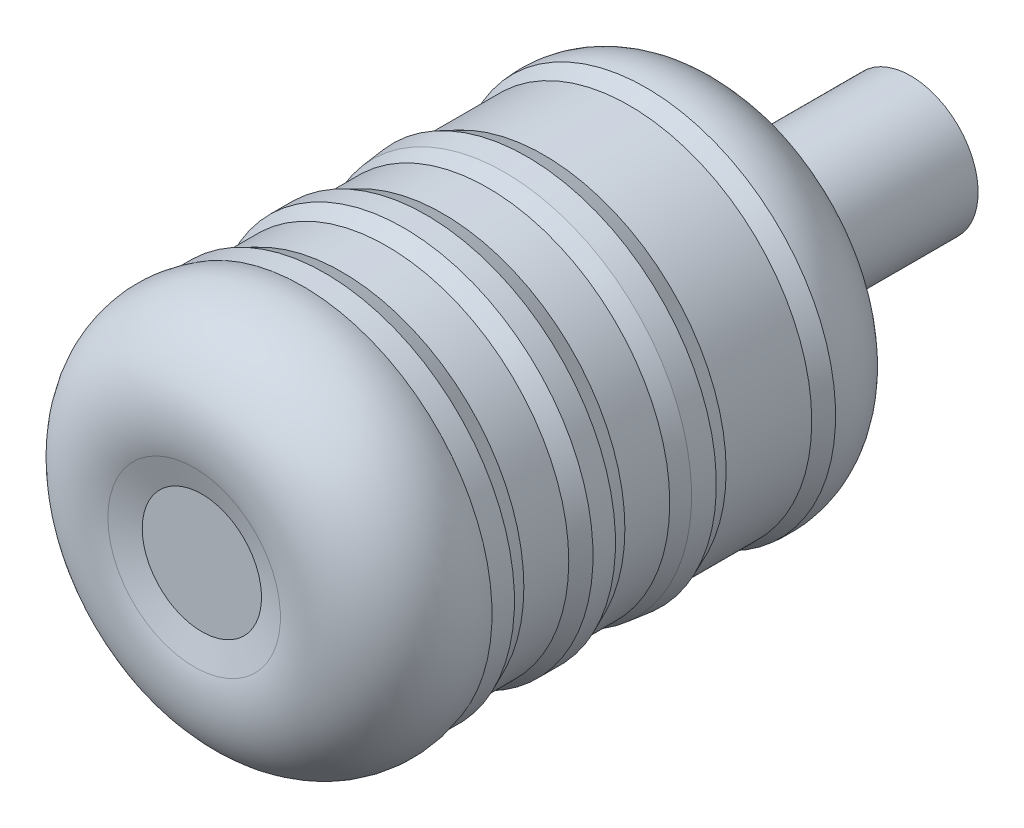
ISO-10303-21;
HEADER;
FILE_DESCRIPTION(('STEP AP214'),'2;1');
FILE_NAME('part.step','',(''),(''),'','','');
FILE_SCHEMA(('AUTOMOTIVE_DESIGN { 1 0 10303 214 1 1 1 1 }'));
ENDSEC;
DATA;
#1=APPLICATION_CONTEXT('core data for automotive mechanical design processes');
#2=APPLICATION_PROTOCOL_DEFINITION('international standard','automotive_design',2000,#1);
#3=PRODUCT_CONTEXT('',#1,'mechanical');
#4=PRODUCT('Part','Part','',(#3));
#5=PRODUCT_RELATED_PRODUCT_CATEGORY('part','',(#4));
#6=PRODUCT_DEFINITION_FORMATION('','',#4);
#7=PRODUCT_DEFINITION_CONTEXT('part definition',#1,'design');
#8=PRODUCT_DEFINITION('design','',#6,#7);
#9=PRODUCT_DEFINITION_SHAPE('','',#8);
#10=(LENGTH_UNIT() NAMED_UNIT(*) SI_UNIT(.MILLI.,.METRE.));
#11=(NAMED_UNIT(*) PLANE_ANGLE_UNIT() SI_UNIT($,.RADIAN.));
#12=(NAMED_UNIT(*) SI_UNIT($,.STERADIAN.) SOLID_ANGLE_UNIT());
#13=UNCERTAINTY_MEASURE_WITH_UNIT(LENGTH_MEASURE(1.E-05),#10,'distance_accuracy_value','');
#14=(GEOMETRIC_REPRESENTATION_CONTEXT(3) GLOBAL_UNCERTAINTY_ASSIGNED_CONTEXT((#13)) GLOBAL_UNIT_ASSIGNED_CONTEXT((#10,
#11,#12)) REPRESENTATION_CONTEXT('',''));
#15=CARTESIAN_POINT('',(0.,0.,0.));
#16=DIRECTION('',(0.,0.,1.));
#17=DIRECTION('',(1.,0.,0.));
#18=AXIS2_PLACEMENT_3D('',#15,#16,#17);
#19=CARTESIAN_POINT('',(501.774797420764,0.,-5.50281641635375));
#20=DIRECTION('',(0.,0.,1.));
#21=DIRECTION('',(1.,0.,0.));
#22=AXIS2_PLACEMENT_3D('',#19,#20,#21);
#23=CONICAL_SURFACE('',#22,42.5,1.28888769328042);
#24=CARTESIAN_POINT('',(501.774797420764,0.,0.));
#25=DIRECTION('',(0.,0.,-1.));
#26=DIRECTION('',(-1.,0.,0.));
#27=AXIS2_PLACEMENT_3D('',#24,#25,#26);
#28=CIRCLE('',#27,61.5000000000001);
#29=CARTESIAN_POINT('',(440.274797420764,0.,0.));
#30=VERTEX_POINT('',#29);
#31=EDGE_CURVE('E10',#30,#30,#28,.T.);
#32=ORIENTED_EDGE('',*,*,#31,.F.);
#33=EDGE_LOOP('',(#32));
#34=FACE_BOUND('',#33,.T.);
#35=CARTESIAN_POINT('',(501.774797420764,0.,-5.50281641635375));
#36=DIRECTION('',(0.,0.,-1.));
#37=DIRECTION('',(-1.,0.,0.));
#38=AXIS2_PLACEMENT_3D('',#35,#36,#37);
#39=CIRCLE('',#38,42.5);
#40=CARTESIAN_POINT('',(459.274797420764,0.,-5.50281641635372));
#41=VERTEX_POINT('',#40);
#42=EDGE_CURVE('E115',#41,#41,#39,.T.);
#43=ORIENTED_EDGE('',*,*,#42,.T.);
#44=EDGE_LOOP('',(#43));
#45=FACE_BOUND('',#44,.T.);
#46=ADVANCED_FACE('F34',(#34,#45),#23,.F.);
#47=CARTESIAN_POINT('',(501.774797420764,0.,-57.5919534258639));
#48=DIRECTION('',(0.,0.,-1.));
#49=DIRECTION('',(-1.,0.,0.));
#50=AXIS2_PLACEMENT_3D('',#47,#48,#49);
#51=TOROIDAL_SURFACE('',#50,78.3275637153188,60.);
#52=CARTESIAN_POINT('',(501.774797420764,0.,-77.2956324112399));
#53=DIRECTION('',(0.,0.,-1.));
#54=DIRECTION('',(-1.,0.,0.));
#55=AXIS2_PLACEMENT_3D('',#52,#53,#54);
#56=CIRCLE('',#55,135.);
#57=CARTESIAN_POINT('',(366.774797420764,0.,-77.2956324112398));
#58=VERTEX_POINT('',#57);
#59=EDGE_CURVE('E41',#58,#58,#56,.T.);
#60=ORIENTED_EDGE('',*,*,#59,.F.);
#61=EDGE_LOOP('',(#60));
#62=FACE_BOUND('',#61,.T.);
#63=ORIENTED_EDGE('',*,*,#31,.T.);
#64=EDGE_LOOP('',(#63));
#65=FACE_BOUND('',#64,.T.);
#66=ADVANCED_FACE('F215',(#62,#65),#51,.T.);
#67=CARTESIAN_POINT('',(501.774797420764,0.,-510.755898754772));
#68=DIRECTION('',(0.,0.,-1.));
#69=DIRECTION('',(-1.,0.,0.));
#70=AXIS2_PLACEMENT_3D('',#67,#68,#69);
#71=CYLINDRICAL_SURFACE('',#70,135.);
#72=ORIENTED_EDGE('',*,*,#59,.T.);
#73=EDGE_LOOP('',(#72));
#74=FACE_BOUND('',#73,.T.);
#75=CARTESIAN_POINT('',(501.774797420764,0.,-93.2956324112398));
#76=DIRECTION('',(0.,0.,-1.));
#77=DIRECTION('',(-1.,0.,0.));
#78=AXIS2_PLACEMENT_3D('',#75,#76,#77);
#79=CIRCLE('',#78,135.);
#80=CARTESIAN_POINT('',(366.774797420764,0.,-93.2956324112398));
#81=VERTEX_POINT('',#80);
#82=EDGE_CURVE('E47',#81,#81,#79,.T.);
#83=ORIENTED_EDGE('',*,*,#82,.F.);
#84=EDGE_LOOP('',(#83));
#85=FACE_BOUND('',#84,.T.);
#86=ADVANCED_FACE('F220',(#74,#85),#71,.T.);
#87=CARTESIAN_POINT('',(501.774797420764,0.,-105.29563241124));
#88=DIRECTION('',(0.,0.,1.));
#89=DIRECTION('',(1.,0.,0.));
#90=AXIS2_PLACEMENT_3D('',#87,#88,#89);
#91=CONICAL_SURFACE('',#90,129.7034295628,0.41566318038225);
#92=ORIENTED_EDGE('',*,*,#82,.T.);
#93=EDGE_LOOP('',(#92));
#94=FACE_BOUND('',#93,.T.);
#95=CARTESIAN_POINT('',(501.774797420764,0.,-105.29563241124));
#96=DIRECTION('',(0.,0.,-1.));
#97=DIRECTION('',(-1.,0.,0.));
#98=AXIS2_PLACEMENT_3D('',#95,#96,#97);
#99=CIRCLE('',#98,129.7034295628);
#100=CARTESIAN_POINT('',(372.071367857964,0.,-105.29563241124));
#101=VERTEX_POINT('',#100);
#102=EDGE_CURVE('E53',#101,#101,#99,.T.);
#103=ORIENTED_EDGE('',*,*,#102,.F.);
#104=EDGE_LOOP('',(#103));
#105=FACE_BOUND('',#104,.T.);
#106=ADVANCED_FACE('F292',(#94,#105),#91,.T.);
#107=CARTESIAN_POINT('',(501.774797420764,0.,-510.755898754772));
#108=DIRECTION('',(0.,0.,-1.));
#109=DIRECTION('',(-1.,0.,0.));
#110=AXIS2_PLACEMENT_3D('',#107,#108,#109);
#111=CYLINDRICAL_SURFACE('',#110,129.7034295628);
#112=ORIENTED_EDGE('',*,*,#102,.T.);
#113=EDGE_LOOP('',(#112));
#114=FACE_BOUND('',#113,.T.);
#115=CARTESIAN_POINT('',(501.774797420764,0.,-137.29563241124));
#116=DIRECTION('',(0.,0.,-1.));
#117=DIRECTION('',(-1.,0.,0.));
#118=AXIS2_PLACEMENT_3D('',#115,#116,#117);
#119=CIRCLE('',#118,129.7034295628);
#120=CARTESIAN_POINT('',(372.071367857964,0.,-137.29563241124));
#121=VERTEX_POINT('',#120);
#122=EDGE_CURVE('E59',#121,#121,#119,.T.);
#123=ORIENTED_EDGE('',*,*,#122,.F.);
#124=EDGE_LOOP('',(#123));
#125=FACE_BOUND('',#124,.T.);
#126=ADVANCED_FACE('F288',(#114,#125),#111,.T.);
#127=CARTESIAN_POINT('',(501.774797420764,0.,-149.29563241124));
#128=DIRECTION('',(0.,0.,-1.));
#129=DIRECTION('',(-1.,0.,0.));
#130=AXIS2_PLACEMENT_3D('',#127,#128,#129);
#131=CONICAL_SURFACE('',#130,135.,0.415663180382242);
#132=ORIENTED_EDGE('',*,*,#122,.T.);
#133=EDGE_LOOP('',(#132));
#134=FACE_BOUND('',#133,.T.);
#135=CARTESIAN_POINT('',(501.774797420764,0.,-149.29563241124));
#136=DIRECTION('',(0.,0.,-1.));
#137=DIRECTION('',(-1.,0.,0.));
#138=AXIS2_PLACEMENT_3D('',#135,#136,#137);
#139=CIRCLE('',#138,135.);
#140=CARTESIAN_POINT('',(366.774797420764,0.,-149.29563241124));
#141=VERTEX_POINT('',#140);
#142=EDGE_CURVE('E63',#141,#141,#139,.T.);
#143=ORIENTED_EDGE('',*,*,#142,.F.);
#144=EDGE_LOOP('',(#143));
#145=FACE_BOUND('',#144,.T.);
#146=ADVANCED_FACE('F284',(#134,#145),#131,.T.);
#147=CARTESIAN_POINT('',(501.774797420764,0.,-510.755898754772));
#148=DIRECTION('',(0.,0.,-1.));
#149=DIRECTION('',(-1.,0.,0.));
#150=AXIS2_PLACEMENT_3D('',#147,#148,#149);
#151=CYLINDRICAL_SURFACE('',#150,135.);
#152=ORIENTED_EDGE('',*,*,#142,.T.);
#153=EDGE_LOOP('',(#152));
#154=FACE_BOUND('',#153,.T.);
#155=CARTESIAN_POINT('',(501.774797420764,0.,-165.29563241124));
#156=DIRECTION('',(0.,0.,-1.));
#157=DIRECTION('',(-1.,0.,0.));
#158=AXIS2_PLACEMENT_3D('',#155,#156,#157);
#159=CIRCLE('',#158,135.);
#160=CARTESIAN_POINT('',(366.774797420764,0.,-165.29563241124));
#161=VERTEX_POINT('',#160);
#162=EDGE_CURVE('E67',#161,#161,#159,.T.);
#163=ORIENTED_EDGE('',*,*,#162,.F.);
#164=EDGE_LOOP('',(#163));
#165=FACE_BOUND('',#164,.T.);
#166=ADVANCED_FACE('F280',(#154,#165),#151,.T.);
#167=CARTESIAN_POINT('',(501.774797420764,0.,-177.29563241124));
#168=DIRECTION('',(0.,0.,1.));
#169=DIRECTION('',(1.,0.,0.));
#170=AXIS2_PLACEMENT_3D('',#167,#168,#169);
#171=CONICAL_SURFACE('',#170,129.7034295628,0.415663180382242);
#172=ORIENTED_EDGE('',*,*,#162,.T.);
#173=EDGE_LOOP('',(#172));
#174=FACE_BOUND('',#173,.T.);
#175=CARTESIAN_POINT('',(501.774797420764,0.,-177.29563241124));
#176=DIRECTION('',(0.,0.,-1.));
#177=DIRECTION('',(-1.,0.,0.));
#178=AXIS2_PLACEMENT_3D('',#175,#176,#177);
#179=CIRCLE('',#178,129.7034295628);
#180=CARTESIAN_POINT('',(372.071367857964,0.,-177.29563241124));
#181=VERTEX_POINT('',#180);
#182=EDGE_CURVE('E71',#181,#181,#179,.T.);
#183=ORIENTED_EDGE('',*,*,#182,.F.);
#184=EDGE_LOOP('',(#183));
#185=FACE_BOUND('',#184,.T.);
#186=ADVANCED_FACE('F276',(#174,#185),#171,.T.);
#187=CARTESIAN_POINT('',(501.774797420764,0.,-510.755898754772));
#188=DIRECTION('',(0.,0.,-1.));
#189=DIRECTION('',(-1.,0.,0.));
#190=AXIS2_PLACEMENT_3D('',#187,#188,#189);
#191=CYLINDRICAL_SURFACE('',#190,129.7034295628);
#192=ORIENTED_EDGE('',*,*,#182,.T.);
#193=EDGE_LOOP('',(#192));
#194=FACE_BOUND('',#193,.T.);
#195=CARTESIAN_POINT('',(501.774797420764,0.,-209.268332015546));
#196=DIRECTION('',(0.,0.,-1.));
#197=DIRECTION('',(-1.,0.,0.));
#198=AXIS2_PLACEMENT_3D('',#195,#196,#197);
#199=CIRCLE('',#198,129.7034295628);
#200=CARTESIAN_POINT('',(372.071367857964,0.,-209.268332015545));
#201=VERTEX_POINT('',#200);
#202=EDGE_CURVE('E75',#201,#201,#199,.T.);
#203=ORIENTED_EDGE('',*,*,#202,.F.);
#204=EDGE_LOOP('',(#203));
#205=FACE_BOUND('',#204,.T.);
#206=ADVANCED_FACE('F272',(#194,#205),#191,.T.);
#207=CARTESIAN_POINT('',(501.774797420764,0.,-221.268332015546));
#208=DIRECTION('',(0.,0.,-1.));
#209=DIRECTION('',(-1.,0.,0.));
#210=AXIS2_PLACEMENT_3D('',#207,#208,#209);
#211=CONICAL_SURFACE('',#210,133.251601016314,0.287489672333788);
#212=ORIENTED_EDGE('',*,*,#202,.T.);
#213=EDGE_LOOP('',(#212));
#214=FACE_BOUND('',#213,.T.);
#215=CARTESIAN_POINT('',(501.774797420764,0.,-221.268332015546));
#216=DIRECTION('',(0.,0.,-1.));
#217=DIRECTION('',(-1.,0.,0.));
#218=AXIS2_PLACEMENT_3D('',#215,#216,#217);
#219=CIRCLE('',#218,133.251601016314);
#220=CARTESIAN_POINT('',(368.52319640445,0.,-221.268332015545));
#221=VERTEX_POINT('',#220);
#222=EDGE_CURVE('E79',#221,#221,#219,.T.);
#223=ORIENTED_EDGE('',*,*,#222,.F.);
#224=EDGE_LOOP('',(#223));
#225=FACE_BOUND('',#224,.T.);
#226=ADVANCED_FACE('F268',(#214,#225),#211,.T.);
#227=CARTESIAN_POINT('',(501.774797420764,0.,-237.172517030624));
#228=DIRECTION('',(0.,0.,-1.));
#229=DIRECTION('',(-1.,0.,0.));
#230=AXIS2_PLACEMENT_3D('',#227,#228,#229);
#231=CONICAL_SURFACE('',#230,135.,0.109493588999654);
#232=ORIENTED_EDGE('',*,*,#222,.T.);
#233=EDGE_LOOP('',(#232));
#234=FACE_BOUND('',#233,.T.);
#235=CARTESIAN_POINT('',(501.774797420764,0.,-237.172517030624));
#236=DIRECTION('',(0.,0.,-1.));
#237=DIRECTION('',(-1.,0.,0.));
#238=AXIS2_PLACEMENT_3D('',#235,#236,#237);
#239=CIRCLE('',#238,135.);
#240=CARTESIAN_POINT('',(366.774797420764,0.,-237.172517030624));
#241=VERTEX_POINT('',#240);
#242=EDGE_CURVE('E83',#241,#241,#239,.T.);
#243=ORIENTED_EDGE('',*,*,#242,.F.);
#244=EDGE_LOOP('',(#243));
#245=FACE_BOUND('',#244,.T.);
#246=ADVANCED_FACE('F264',(#234,#245),#231,.T.);
#247=CARTESIAN_POINT('',(501.774797420764,0.,-237.172517030624));
#248=DIRECTION('',(0.,0.,1.));
#249=DIRECTION('',(1.,0.,0.));
#250=AXIS2_PLACEMENT_3D('',#247,#248,#249);
#251=CONICAL_SURFACE('',#250,135.,0.394791119699769);
#252=CARTESIAN_POINT('',(501.774797420764,0.,-249.172517030624));
#253=DIRECTION('',(0.,0.,-1.));
#254=DIRECTION('',(-1.,0.,0.));
#255=AXIS2_PLACEMENT_3D('',#252,#253,#254);
#256=CIRCLE('',#255,130.);
#257=CARTESIAN_POINT('',(371.774797420764,0.,-249.172517030624));
#258=VERTEX_POINT('',#257);
#259=EDGE_CURVE('E87',#258,#258,#256,.T.);
#260=ORIENTED_EDGE('',*,*,#259,.F.);
#261=EDGE_LOOP('',(#260));
#262=FACE_BOUND('',#261,.T.);
#263=ORIENTED_EDGE('',*,*,#242,.T.);
#264=EDGE_LOOP('',(#263));
#265=FACE_BOUND('',#264,.T.);
#266=ADVANCED_FACE('F260',(#262,#265),#251,.T.);
#267=CARTESIAN_POINT('',(501.774797420764,0.,-510.755898754772));
#268=DIRECTION('',(0.,0.,-1.));
#269=DIRECTION('',(-1.,0.,0.));
#270=AXIS2_PLACEMENT_3D('',#267,#268,#269);
#271=CYLINDRICAL_SURFACE('',#270,130.);
#272=ORIENTED_EDGE('',*,*,#259,.T.);
#273=EDGE_LOOP('',(#272));
#274=FACE_BOUND('',#273,.T.);
#275=CARTESIAN_POINT('',(501.774797420764,0.,-310.172517030624));
#276=DIRECTION('',(0.,0.,-1.));
#277=DIRECTION('',(-1.,0.,0.));
#278=AXIS2_PLACEMENT_3D('',#275,#276,#277);
#279=CIRCLE('',#278,130.);
#280=CARTESIAN_POINT('',(371.774797420764,0.,-310.172517030624));
#281=VERTEX_POINT('',#280);
#282=EDGE_CURVE('E91',#281,#281,#279,.T.);
#283=ORIENTED_EDGE('',*,*,#282,.F.);
#284=EDGE_LOOP('',(#283));
#285=FACE_BOUND('',#284,.T.);
#286=ADVANCED_FACE('F256',(#274,#285),#271,.T.);
#287=CARTESIAN_POINT('',(501.774797420764,0.,-322.172517030624));
#288=DIRECTION('',(0.,0.,-1.));
#289=DIRECTION('',(-1.,0.,0.));
#290=AXIS2_PLACEMENT_3D('',#287,#288,#289);
#291=CONICAL_SURFACE('',#290,135.,0.394791119699754);
#292=ORIENTED_EDGE('',*,*,#282,.T.);
#293=EDGE_LOOP('',(#292));
#294=FACE_BOUND('',#293,.T.);
#295=CARTESIAN_POINT('',(501.774797420764,0.,-322.172517030624));
#296=DIRECTION('',(0.,0.,-1.));
#297=DIRECTION('',(-1.,0.,0.));
#298=AXIS2_PLACEMENT_3D('',#295,#296,#297);
#299=CIRCLE('',#298,135.);
#300=CARTESIAN_POINT('',(366.774797420764,0.,-322.172517030624));
#301=VERTEX_POINT('',#300);
#302=EDGE_CURVE('E95',#301,#301,#299,.T.);
#303=ORIENTED_EDGE('',*,*,#302,.F.);
#304=EDGE_LOOP('',(#303));
#305=FACE_BOUND('',#304,.T.);
#306=ADVANCED_FACE('F252',(#294,#305),#291,.T.);
#307=CARTESIAN_POINT('',(501.774797420764,0.,-328.860913406549));
#308=DIRECTION('',(0.,0.,-1.));
#309=DIRECTION('',(-1.,0.,0.));
#310=AXIS2_PLACEMENT_3D('',#307,#308,#309);
#311=TOROIDAL_SURFACE('',#310,80.4081933444357,55.);
#312=ORIENTED_EDGE('',*,*,#302,.T.);
#313=EDGE_LOOP('',(#312));
#314=FACE_BOUND('',#313,.T.);
#315=CARTESIAN_POINT('',(501.774797420764,0.,-381.516955266005));
#316=DIRECTION('',(0.,0.,-1.));
#317=DIRECTION('',(-1.,0.,0.));
#318=AXIS2_PLACEMENT_3D('',#315,#316,#317);
#319=CIRCLE('',#318,96.2934461184751);
#320=CARTESIAN_POINT('',(405.481351302289,0.,-381.516955266005));
#321=VERTEX_POINT('',#320);
#322=EDGE_CURVE('E99',#321,#321,#319,.T.);
#323=ORIENTED_EDGE('',*,*,#322,.F.);
#324=EDGE_LOOP('',(#323));
#325=FACE_BOUND('',#324,.T.);
#326=ADVANCED_FACE('F248',(#314,#325),#311,.T.);
#327=CARTESIAN_POINT('',(501.774797420764,0.,-393.179147668479));
#328=DIRECTION('',(0.,0.,1.));
#329=DIRECTION('',(1.,0.,0.));
#330=AXIS2_PLACEMENT_3D('',#327,#328,#329);
#331=CONICAL_SURFACE('',#330,57.6359000250782,1.27779934327629);
#332=ORIENTED_EDGE('',*,*,#322,.T.);
#333=EDGE_LOOP('',(#332));
#334=FACE_BOUND('',#333,.T.);
#335=CARTESIAN_POINT('',(501.774797420764,0.,-393.179147668479));
#336=DIRECTION('',(0.,0.,-1.));
#337=DIRECTION('',(-1.,0.,0.));
#338=AXIS2_PLACEMENT_3D('',#335,#336,#337);
#339=CIRCLE('',#338,57.6359000250783);
#340=CARTESIAN_POINT('',(444.138897395686,0.,-393.179147668479));
#341=VERTEX_POINT('',#340);
#342=EDGE_CURVE('E103',#341,#341,#339,.T.);
#343=ORIENTED_EDGE('',*,*,#342,.F.);
#344=EDGE_LOOP('',(#343));
#345=FACE_BOUND('',#344,.T.);
#346=ADVANCED_FACE('F244',(#334,#345),#331,.T.);
#347=CARTESIAN_POINT('',(501.774797420764,0.,-403.172517030624));
#348=DIRECTION('',(0.,0.,-1.));
#349=DIRECTION('',(-1.,0.,0.));
#350=AXIS2_PLACEMENT_3D('',#347,#348,#349);
#351=TOROIDAL_SURFACE('',#350,58.,10.);
#352=ORIENTED_EDGE('',*,*,#342,.T.);
#353=EDGE_LOOP('',(#352));
#354=FACE_BOUND('',#353,.T.);
#355=CARTESIAN_POINT('',(501.774797420764,0.,-403.172517030624));
#356=DIRECTION('',(0.,0.,-1.));
#357=DIRECTION('',(-1.,0.,0.));
#358=AXIS2_PLACEMENT_3D('',#355,#356,#357);
#359=CIRCLE('',#358,48.);
#360=CARTESIAN_POINT('',(453.774797420764,0.,-403.172517030624));
#361=VERTEX_POINT('',#360);
#362=EDGE_CURVE('E107',#361,#361,#359,.T.);
#363=ORIENTED_EDGE('',*,*,#362,.F.);
#364=EDGE_LOOP('',(#363));
#365=FACE_BOUND('',#364,.T.);
#366=ADVANCED_FACE('F240',(#354,#365),#351,.F.);
#367=CARTESIAN_POINT('',(501.774797420764,0.,-510.755898754772));
#368=DIRECTION('',(0.,0.,-1.));
#369=DIRECTION('',(-1.,0.,0.));
#370=AXIS2_PLACEMENT_3D('',#367,#368,#369);
#371=CYLINDRICAL_SURFACE('',#370,48.);
#372=ORIENTED_EDGE('',*,*,#362,.T.);
#373=EDGE_LOOP('',(#372));
#374=FACE_BOUND('',#373,.T.);
#375=CARTESIAN_POINT('',(501.774797420764,0.,-510.755898754772));
#376=DIRECTION('',(0.,0.,-1.));
#377=DIRECTION('',(-1.,0.,0.));
#378=AXIS2_PLACEMENT_3D('',#375,#376,#377);
#379=CIRCLE('',#378,48.);
#380=CARTESIAN_POINT('',(453.774797420764,0.,-510.755898754772));
#381=VERTEX_POINT('',#380);
#382=EDGE_CURVE('E111',#381,#381,#379,.T.);
#383=ORIENTED_EDGE('',*,*,#382,.F.);
#384=EDGE_LOOP('',(#383));
#385=FACE_BOUND('',#384,.T.);
#386=ADVANCED_FACE('F231',(#374,#385),#371,.T.);
#387=CARTESIAN_POINT('',(0.,0.,-510.755898754772));
#388=DIRECTION('',(0.,0.,1.));
#389=DIRECTION('',(1.,0.,0.));
#390=AXIS2_PLACEMENT_3D('',#387,#388,#389);
#391=PLANE('',#390);
#392=CARTESIAN_POINT('',(501.774797420764,0.,-510.755898754772));
#393=DIRECTION('',(0.,0.,1.));
#394=DIRECTION('',(1.,0.,0.));
#395=AXIS2_PLACEMENT_3D('',#392,#393,#394);
#396=CIRCLE('',#395,46.);
#397=CARTESIAN_POINT('',(547.774797420764,0.,-510.755898754772));
#398=VERTEX_POINT('',#397);
#399=EDGE_CURVE('E120',#398,#398,#396,.F.);
#400=ORIENTED_EDGE('',*,*,#399,.F.);
#401=EDGE_LOOP('',(#400));
#402=FACE_BOUND('',#401,.T.);
#403=ORIENTED_EDGE('',*,*,#382,.T.);
#404=EDGE_LOOP('',(#403));
#405=FACE_BOUND('',#404,.T.);
#406=ADVANCED_FACE('F226',(#402,#405),#391,.F.);
#407=CARTESIAN_POINT('',(0.,0.,-5.50281641635346));
#408=DIRECTION('',(0.,0.,-1.));
#409=DIRECTION('',(-1.,0.,0.));
#410=AXIS2_PLACEMENT_3D('',#407,#408,#409);
#411=PLANE('',#410);
#412=ORIENTED_EDGE('',*,*,#42,.F.);
#413=EDGE_LOOP('',(#412));
#414=FACE_BOUND('',#413,.T.);
#415=ADVANCED_FACE('F212',(#414),#411,.F.);
#416=CARTESIAN_POINT('',(501.774797420764,0.,-7.42386886929987));
#417=DIRECTION('',(0.,0.,1.));
#418=DIRECTION('',(1.,0.,0.));
#419=AXIS2_PLACEMENT_3D('',#416,#417,#418);
#420=CONICAL_SURFACE('',#419,43.0563788934078,1.28888769328042);
#421=CARTESIAN_POINT('',(501.774797420764,0.,-1.92038922630883));
#422=DIRECTION('',(0.,0.,1.));
#423=DIRECTION('',(1.,0.,0.));
#424=AXIS2_PLACEMENT_3D('',#421,#422,#423);
#425=CIRCLE('',#424,62.0586688673331);
#426=CARTESIAN_POINT('',(563.833466288097,0.,-1.92038922630888));
#427=VERTEX_POINT('',#426);
#428=EDGE_CURVE('E119',#427,#427,#425,.F.);
#429=ORIENTED_EDGE('',*,*,#428,.T.);
#430=EDGE_LOOP('',(#429));
#431=FACE_BOUND('',#430,.T.);
#432=CARTESIAN_POINT('',(501.774797420764,0.,-7.50281641635379));
#433=DIRECTION('',(0.,0.,-1.));
#434=DIRECTION('',(-1.,0.,0.));
#435=AXIS2_PLACEMENT_3D('',#432,#433,#434);
#436=CIRCLE('',#435,42.7837905894319);
#437=CARTESIAN_POINT('',(458.991006831332,0.,-7.50281641635376));
#438=VERTEX_POINT('',#437);
#439=EDGE_CURVE('E125',#438,#438,#436,.T.);
#440=ORIENTED_EDGE('',*,*,#439,.F.);
#441=EDGE_LOOP('',(#440));
#442=FACE_BOUND('',#441,.T.);
#443=ADVANCED_FACE('F197',(#431,#442),#420,.T.);
#444=CARTESIAN_POINT('',(501.774797420764,0.,-57.5919534258639));
#445=DIRECTION('',(0.,0.,-1.));
#446=DIRECTION('',(-1.,0.,0.));
#447=AXIS2_PLACEMENT_3D('',#444,#445,#446);
#448=TOROIDAL_SURFACE('',#447,78.3275637153188,58.);
#449=CARTESIAN_POINT('',(501.774797420764,0.,-76.9549260978861));
#450=DIRECTION('',(0.,0.,1.));
#451=DIRECTION('',(1.,0.,0.));
#452=AXIS2_PLACEMENT_3D('',#449,#450,#451);
#453=CIRCLE('',#452,133.);
#454=CARTESIAN_POINT('',(634.774797420764,0.,-76.9549260978861));
#455=VERTEX_POINT('',#454);
#456=EDGE_CURVE('E185',#455,#455,#453,.F.);
#457=ORIENTED_EDGE('',*,*,#456,.T.);
#458=EDGE_LOOP('',(#457));
#459=FACE_BOUND('',#458,.T.);
#460=ORIENTED_EDGE('',*,*,#428,.F.);
#461=EDGE_LOOP('',(#460));
#462=FACE_BOUND('',#461,.T.);
#463=ADVANCED_FACE('F200',(#459,#462),#448,.F.);
#464=CARTESIAN_POINT('',(501.774797420764,0.,-510.755898754772));
#465=DIRECTION('',(0.,0.,-1.));
#466=DIRECTION('',(-1.,0.,0.));
#467=AXIS2_PLACEMENT_3D('',#464,#465,#466);
#468=CYLINDRICAL_SURFACE('',#467,133.);
#469=ORIENTED_EDGE('',*,*,#456,.F.);
#470=EDGE_LOOP('',(#469));
#471=FACE_BOUND('',#470,.T.);
#472=CARTESIAN_POINT('',(501.774797420764,0.,-92.87387927513));
#473=DIRECTION('',(0.,0.,1.));
#474=DIRECTION('',(1.,0.,0.));
#475=AXIS2_PLACEMENT_3D('',#472,#473,#474);
#476=CIRCLE('',#475,133.);
#477=CARTESIAN_POINT('',(634.774797420764,0.,-92.8738792751301));
#478=VERTEX_POINT('',#477);
#479=EDGE_CURVE('E181',#478,#478,#476,.F.);
#480=ORIENTED_EDGE('',*,*,#479,.T.);
#481=EDGE_LOOP('',(#480));
#482=FACE_BOUND('',#481,.T.);
#483=ADVANCED_FACE('F202',(#471,#482),#468,.F.);
#484=CARTESIAN_POINT('',(501.774797420764,0.,-104.488038953501));
#485=DIRECTION('',(0.,0.,1.));
#486=DIRECTION('',(1.,0.,0.));
#487=AXIS2_PLACEMENT_3D('',#484,#485,#486);
#488=CONICAL_SURFACE('',#487,127.873732099551,0.41566318038225);
#489=ORIENTED_EDGE('',*,*,#479,.F.);
#490=EDGE_LOOP('',(#489));
#491=FACE_BOUND('',#490,.T.);
#492=CARTESIAN_POINT('',(501.774797420764,0.,-104.87387927513));
#493=DIRECTION('',(0.,0.,1.));
#494=DIRECTION('',(1.,0.,0.));
#495=AXIS2_PLACEMENT_3D('',#492,#493,#494);
#496=CIRCLE('',#495,127.7034295628);
#497=CARTESIAN_POINT('',(629.478226983564,0.,-104.87387927513));
#498=VERTEX_POINT('',#497);
#499=EDGE_CURVE('E177',#498,#498,#496,.F.);
#500=ORIENTED_EDGE('',*,*,#499,.T.);
#501=EDGE_LOOP('',(#500));
#502=FACE_BOUND('',#501,.T.);
#503=ADVANCED_FACE('F209',(#491,#502),#488,.F.);
#504=CARTESIAN_POINT('',(501.774797420764,0.,-510.755898754772));
#505=DIRECTION('',(0.,0.,-1.));
#506=DIRECTION('',(-1.,0.,0.));
#507=AXIS2_PLACEMENT_3D('',#504,#505,#506);
#508=CYLINDRICAL_SURFACE('',#507,127.7034295628);
#509=ORIENTED_EDGE('',*,*,#499,.F.);
#510=EDGE_LOOP('',(#509));
#511=FACE_BOUND('',#510,.T.);
#512=CARTESIAN_POINT('',(501.774797420764,0.,-137.71738554735));
#513=DIRECTION('',(0.,0.,-1.));
#514=DIRECTION('',(-1.,0.,0.));
#515=AXIS2_PLACEMENT_3D('',#512,#513,#514);
#516=CIRCLE('',#515,127.7034295628);
#517=CARTESIAN_POINT('',(374.071367857964,0.,-137.71738554735));
#518=VERTEX_POINT('',#517);
#519=EDGE_CURVE('E173',#518,#518,#516,.T.);
#520=ORIENTED_EDGE('',*,*,#519,.T.);
#521=EDGE_LOOP('',(#520));
#522=FACE_BOUND('',#521,.T.);
#523=ADVANCED_FACE('F414',(#511,#522),#508,.F.);
#524=CARTESIAN_POINT('',(501.774797420764,0.,-150.103225868978));
#525=DIRECTION('',(0.,0.,-1.));
#526=DIRECTION('',(-1.,0.,0.));
#527=AXIS2_PLACEMENT_3D('',#524,#525,#526);
#528=CONICAL_SURFACE('',#527,133.170302536752,0.415663180382242);
#529=ORIENTED_EDGE('',*,*,#519,.F.);
#530=EDGE_LOOP('',(#529));
#531=FACE_BOUND('',#530,.T.);
#532=CARTESIAN_POINT('',(501.774797420764,0.,-149.71738554735));
#533=DIRECTION('',(0.,0.,-1.));
#534=DIRECTION('',(-1.,0.,0.));
#535=AXIS2_PLACEMENT_3D('',#532,#533,#534);
#536=CIRCLE('',#535,133.);
#537=CARTESIAN_POINT('',(368.774797420764,0.,-149.71738554735));
#538=VERTEX_POINT('',#537);
#539=EDGE_CURVE('E169',#538,#538,#536,.T.);
#540=ORIENTED_EDGE('',*,*,#539,.T.);
#541=EDGE_LOOP('',(#540));
#542=FACE_BOUND('',#541,.T.);
#543=ADVANCED_FACE('F424',(#531,#542),#528,.F.);
#544=CARTESIAN_POINT('',(501.774797420764,0.,-510.755898754772));
#545=DIRECTION('',(0.,0.,-1.));
#546=DIRECTION('',(-1.,0.,0.));
#547=AXIS2_PLACEMENT_3D('',#544,#545,#546);
#548=CYLINDRICAL_SURFACE('',#547,133.);
#549=ORIENTED_EDGE('',*,*,#539,.F.);
#550=EDGE_LOOP('',(#549));
#551=FACE_BOUND('',#550,.T.);
#552=CARTESIAN_POINT('',(501.774797420764,0.,-164.87387927513));
#553=DIRECTION('',(0.,0.,1.));
#554=DIRECTION('',(1.,0.,0.));
#555=AXIS2_PLACEMENT_3D('',#552,#553,#554);
#556=CIRCLE('',#555,133.);
#557=CARTESIAN_POINT('',(634.774797420764,0.,-164.87387927513));
#558=VERTEX_POINT('',#557);
#559=EDGE_CURVE('E165',#558,#558,#556,.F.);
#560=ORIENTED_EDGE('',*,*,#559,.T.);
#561=EDGE_LOOP('',(#560));
#562=FACE_BOUND('',#561,.T.);
#563=ADVANCED_FACE('F434',(#551,#562),#548,.F.);
#564=CARTESIAN_POINT('',(501.774797420764,0.,-176.488038953501));
#565=DIRECTION('',(0.,0.,1.));
#566=DIRECTION('',(1.,0.,0.));
#567=AXIS2_PLACEMENT_3D('',#564,#565,#566);
#568=CONICAL_SURFACE('',#567,127.873732099551,0.415663180382242);
#569=ORIENTED_EDGE('',*,*,#559,.F.);
#570=EDGE_LOOP('',(#569));
#571=FACE_BOUND('',#570,.T.);
#572=CARTESIAN_POINT('',(501.774797420764,0.,-176.87387927513));
#573=DIRECTION('',(0.,0.,1.));
#574=DIRECTION('',(1.,0.,0.));
#575=AXIS2_PLACEMENT_3D('',#572,#573,#574);
#576=CIRCLE('',#575,127.7034295628);
#577=CARTESIAN_POINT('',(629.478226983564,0.,-176.87387927513));
#578=VERTEX_POINT('',#577);
#579=EDGE_CURVE('E161',#578,#578,#576,.F.);
#580=ORIENTED_EDGE('',*,*,#579,.T.);
#581=EDGE_LOOP('',(#580));
#582=FACE_BOUND('',#581,.T.);
#583=ADVANCED_FACE('F444',(#571,#582),#568,.F.);
#584=CARTESIAN_POINT('',(501.774797420764,0.,-510.755898754772));
#585=DIRECTION('',(0.,0.,-1.));
#586=DIRECTION('',(-1.,0.,0.));
#587=AXIS2_PLACEMENT_3D('',#584,#585,#586);
#588=CYLINDRICAL_SURFACE('',#587,127.7034295628);
#589=ORIENTED_EDGE('',*,*,#579,.F.);
#590=EDGE_LOOP('',(#589));
#591=FACE_BOUND('',#590,.T.);
#592=CARTESIAN_POINT('',(501.774797420764,0.,-209.557818284019));
#593=DIRECTION('',(0.,0.,-1.));
#594=DIRECTION('',(-1.,0.,0.));
#595=AXIS2_PLACEMENT_3D('',#592,#593,#594);
#596=CIRCLE('',#595,127.7034295628);
#597=CARTESIAN_POINT('',(374.071367857964,0.,-209.557818284019));
#598=VERTEX_POINT('',#597);
#599=EDGE_CURVE('E157',#598,#598,#596,.T.);
#600=ORIENTED_EDGE('',*,*,#599,.T.);
#601=EDGE_LOOP('',(#600));
#602=FACE_BOUND('',#601,.T.);
#603=ADVANCED_FACE('F454',(#591,#602),#588,.F.);
#604=CARTESIAN_POINT('',(501.774797420764,0.,-221.835423656588));
#605=DIRECTION('',(0.,0.,-1.));
#606=DIRECTION('',(-1.,0.,0.));
#607=AXIS2_PLACEMENT_3D('',#604,#605,#606);
#608=CONICAL_SURFACE('',#607,131.333683637838,0.287489672333788);
#609=ORIENTED_EDGE('',*,*,#599,.F.);
#610=EDGE_LOOP('',(#609));
#611=FACE_BOUND('',#610,.T.);
#612=CARTESIAN_POINT('',(501.774797420764,0.,-221.664280672405));
#613=DIRECTION('',(0.,0.,-1.));
#614=DIRECTION('',(-1.,0.,0.));
#615=AXIS2_PLACEMENT_3D('',#612,#613,#614);
#616=CIRCLE('',#615,131.283079916926);
#617=CARTESIAN_POINT('',(370.491717503838,0.,-221.664280672405));
#618=VERTEX_POINT('',#617);
#619=EDGE_CURVE('E153',#618,#618,#616,.T.);
#620=ORIENTED_EDGE('',*,*,#619,.T.);
#621=EDGE_LOOP('',(#620));
#622=FACE_BOUND('',#621,.T.);
#623=ADVANCED_FACE('F464',(#611,#622),#608,.F.);
#624=CARTESIAN_POINT('',(501.774797420764,0.,-237.391066903585));
#625=DIRECTION('',(0.,0.,-1.));
#626=DIRECTION('',(-1.,0.,0.));
#627=AXIS2_PLACEMENT_3D('',#624,#625,#626);
#628=CONICAL_SURFACE('',#627,133.011976873115,0.109493588999654);
#629=ORIENTED_EDGE('',*,*,#619,.F.);
#630=EDGE_LOOP('',(#629));
#631=FACE_BOUND('',#630,.T.);
#632=CARTESIAN_POINT('',(501.774797420764,0.,-236.878902030974));
#633=DIRECTION('',(0.,0.,1.));
#634=DIRECTION('',(1.,0.,0.));
#635=AXIS2_PLACEMENT_3D('',#632,#633,#634);
#636=CIRCLE('',#635,132.955672916521);
#637=CARTESIAN_POINT('',(634.730470337285,0.,-236.878902030974));
#638=VERTEX_POINT('',#637);
#639=EDGE_CURVE('E149',#638,#638,#636,.F.);
#640=ORIENTED_EDGE('',*,*,#639,.T.);
#641=EDGE_LOOP('',(#640));
#642=FACE_BOUND('',#641,.T.);
#643=ADVANCED_FACE('F474',(#631,#642),#628,.F.);
#644=CARTESIAN_POINT('',(501.774797420764,0.,-236.403286261393));
#645=DIRECTION('',(0.,0.,1.));
#646=DIRECTION('',(1.,0.,0.));
#647=AXIS2_PLACEMENT_3D('',#644,#645,#646);
#648=CONICAL_SURFACE('',#647,133.153846153846,0.394791119699769);
#649=CARTESIAN_POINT('',(501.774797420764,0.,-248.772517030624));
#650=DIRECTION('',(0.,0.,1.));
#651=DIRECTION('',(1.,0.,0.));
#652=AXIS2_PLACEMENT_3D('',#649,#650,#651);
#653=CIRCLE('',#652,128.);
#654=CARTESIAN_POINT('',(629.774797420764,0.,-248.772517030624));
#655=VERTEX_POINT('',#654);
#656=EDGE_CURVE('E145',#655,#655,#653,.F.);
#657=ORIENTED_EDGE('',*,*,#656,.T.);
#658=EDGE_LOOP('',(#657));
#659=FACE_BOUND('',#658,.T.);
#660=ORIENTED_EDGE('',*,*,#639,.F.);
#661=EDGE_LOOP('',(#660));
#662=FACE_BOUND('',#661,.T.);
#663=ADVANCED_FACE('F484',(#659,#662),#648,.F.);
#664=CARTESIAN_POINT('',(501.774797420764,0.,-510.755898754772));
#665=DIRECTION('',(0.,0.,-1.));
#666=DIRECTION('',(-1.,0.,0.));
#667=AXIS2_PLACEMENT_3D('',#664,#665,#666);
#668=CYLINDRICAL_SURFACE('',#667,128.);
#669=ORIENTED_EDGE('',*,*,#656,.F.);
#670=EDGE_LOOP('',(#669));
#671=FACE_BOUND('',#670,.T.);
#672=CARTESIAN_POINT('',(501.774797420764,0.,-310.572517030624));
#673=DIRECTION('',(0.,0.,-1.));
#674=DIRECTION('',(-1.,0.,0.));
#675=AXIS2_PLACEMENT_3D('',#672,#673,#674);
#676=CIRCLE('',#675,128.);
#677=CARTESIAN_POINT('',(373.774797420764,0.,-310.572517030624));
#678=VERTEX_POINT('',#677);
#679=EDGE_CURVE('E141',#678,#678,#676,.T.);
#680=ORIENTED_EDGE('',*,*,#679,.T.);
#681=EDGE_LOOP('',(#680));
#682=FACE_BOUND('',#681,.T.);
#683=ADVANCED_FACE('F494',(#671,#682),#668,.F.);
#684=CARTESIAN_POINT('',(501.774797420764,0.,-322.941747799855));
#685=DIRECTION('',(0.,0.,-1.));
#686=DIRECTION('',(-1.,0.,0.));
#687=AXIS2_PLACEMENT_3D('',#684,#685,#686);
#688=CONICAL_SURFACE('',#687,133.153846153846,0.394791119699754);
#689=ORIENTED_EDGE('',*,*,#679,.F.);
#690=EDGE_LOOP('',(#689));
#691=FACE_BOUND('',#690,.T.);
#692=CARTESIAN_POINT('',(501.774797420764,0.,-322.685889557773));
#693=DIRECTION('',(0.,0.,1.));
#694=DIRECTION('',(1.,0.,0.));
#695=AXIS2_PLACEMENT_3D('',#692,#693,#694);
#696=CIRCLE('',#695,133.047238552979);
#697=CARTESIAN_POINT('',(634.822035973743,0.,-322.685889557773));
#698=VERTEX_POINT('',#697);
#699=EDGE_CURVE('E137',#698,#698,#696,.F.);
#700=ORIENTED_EDGE('',*,*,#699,.T.);
#701=EDGE_LOOP('',(#700));
#702=FACE_BOUND('',#701,.T.);
#703=ADVANCED_FACE('F504',(#691,#702),#688,.F.);
#704=CARTESIAN_POINT('',(501.774797420764,0.,-328.860913406549));
#705=DIRECTION('',(0.,0.,-1.));
#706=DIRECTION('',(-1.,0.,0.));
#707=AXIS2_PLACEMENT_3D('',#704,#705,#706);
#708=TOROIDAL_SURFACE('',#707,80.4081933444357,53.);
#709=ORIENTED_EDGE('',*,*,#699,.F.);
#710=EDGE_LOOP('',(#709));
#711=FACE_BOUND('',#710,.T.);
#712=CARTESIAN_POINT('',(501.774797420764,0.,-379.60219010748));
#713=DIRECTION('',(0.,0.,1.));
#714=DIRECTION('',(1.,0.,0.));
#715=AXIS2_PLACEMENT_3D('',#712,#713,#714);
#716=CIRCLE('',#715,95.7158005630555);
#717=CARTESIAN_POINT('',(597.490597983819,0.,-379.60219010748));
#718=VERTEX_POINT('',#717);
#719=EDGE_CURVE('E133',#718,#718,#716,.F.);
#720=ORIENTED_EDGE('',*,*,#719,.T.);
#721=EDGE_LOOP('',(#720));
#722=FACE_BOUND('',#721,.T.);
#723=ADVANCED_FACE('F514',(#711,#722),#708,.F.);
#724=CARTESIAN_POINT('',(501.774797420764,0.,-391.264382509953));
#725=DIRECTION('',(0.,0.,1.));
#726=DIRECTION('',(1.,0.,0.));
#727=AXIS2_PLACEMENT_3D('',#724,#725,#726);
#728=CONICAL_SURFACE('',#727,57.0582544696586,1.27779934327629);
#729=ORIENTED_EDGE('',*,*,#719,.F.);
#730=EDGE_LOOP('',(#729));
#731=FACE_BOUND('',#730,.T.);
#732=CARTESIAN_POINT('',(501.774797420764,0.,-391.193312986625));
#733=DIRECTION('',(0.,0.,-1.));
#734=DIRECTION('',(-1.,0.,0.));
#735=AXIS2_PLACEMENT_3D('',#732,#733,#734);
#736=CIRCLE('',#735,57.2938339626968);
#737=CARTESIAN_POINT('',(444.480963458067,0.,-391.193312986625));
#738=VERTEX_POINT('',#737);
#739=EDGE_CURVE('E129',#738,#738,#736,.T.);
#740=ORIENTED_EDGE('',*,*,#739,.T.);
#741=EDGE_LOOP('',(#740));
#742=FACE_BOUND('',#741,.T.);
#743=ADVANCED_FACE('F524',(#731,#742),#728,.F.);
#744=CARTESIAN_POINT('',(501.774797420764,0.,-403.172517030624));
#745=DIRECTION('',(0.,0.,-1.));
#746=DIRECTION('',(-1.,0.,0.));
#747=AXIS2_PLACEMENT_3D('',#744,#745,#746);
#748=TOROIDAL_SURFACE('',#747,58.,12.);
#749=ORIENTED_EDGE('',*,*,#739,.F.);
#750=EDGE_LOOP('',(#749));
#751=FACE_BOUND('',#750,.T.);
#752=CARTESIAN_POINT('',(501.774797420764,0.,-403.172517030624));
#753=DIRECTION('',(0.,0.,-1.));
#754=DIRECTION('',(-1.,0.,0.));
#755=AXIS2_PLACEMENT_3D('',#752,#753,#754);
#756=CIRCLE('',#755,46.);
#757=CARTESIAN_POINT('',(455.774797420764,0.,-403.172517030624));
#758=VERTEX_POINT('',#757);
#759=EDGE_CURVE('E124',#758,#758,#756,.T.);
#760=ORIENTED_EDGE('',*,*,#759,.T.);
#761=EDGE_LOOP('',(#760));
#762=FACE_BOUND('',#761,.T.);
#763=ADVANCED_FACE('F534',(#751,#762),#748,.T.);
#764=CARTESIAN_POINT('',(501.774797420764,0.,-510.755898754772));
#765=DIRECTION('',(0.,0.,-1.));
#766=DIRECTION('',(-1.,0.,0.));
#767=AXIS2_PLACEMENT_3D('',#764,#765,#766);
#768=CYLINDRICAL_SURFACE('',#767,46.);
#769=ORIENTED_EDGE('',*,*,#759,.F.);
#770=EDGE_LOOP('',(#769));
#771=FACE_BOUND('',#770,.T.);
#772=ORIENTED_EDGE('',*,*,#399,.T.);
#773=EDGE_LOOP('',(#772));
#774=FACE_BOUND('',#773,.T.);
#775=ADVANCED_FACE('F544',(#771,#774),#768,.F.);
#776=CARTESIAN_POINT('',(0.,0.,-7.50281641635346));
#777=DIRECTION('',(0.,0.,-1.));
#778=DIRECTION('',(-1.,0.,0.));
#779=AXIS2_PLACEMENT_3D('',#776,#777,#778);
#780=PLANE('',#779);
#781=ORIENTED_EDGE('',*,*,#439,.T.);
#782=EDGE_LOOP('',(#781));
#783=FACE_BOUND('',#782,.T.);
#784=ADVANCED_FACE('F235',(#783),#780,.T.);
#785=CLOSED_SHELL('',(#46,#66,#86,#106,#126,#146,#166,#186,#206,#226,#246,#266,#286,#306,#326,
#346,#366,#386,#406,#415,#443,#463,#483,#503,#523,#543,#563,#583,#603,#623,#643,#663,#683,#703,
#723,#743,#763,#775,#784));
#786=MANIFOLD_SOLID_BREP('B2',#785);
#787=ADVANCED_BREP_SHAPE_REPRESENTATION('',(#18,#786),#14);
#788=SHAPE_DEFINITION_REPRESENTATION(#9,#787);
ENDSEC;
END-ISO-10303-21;
